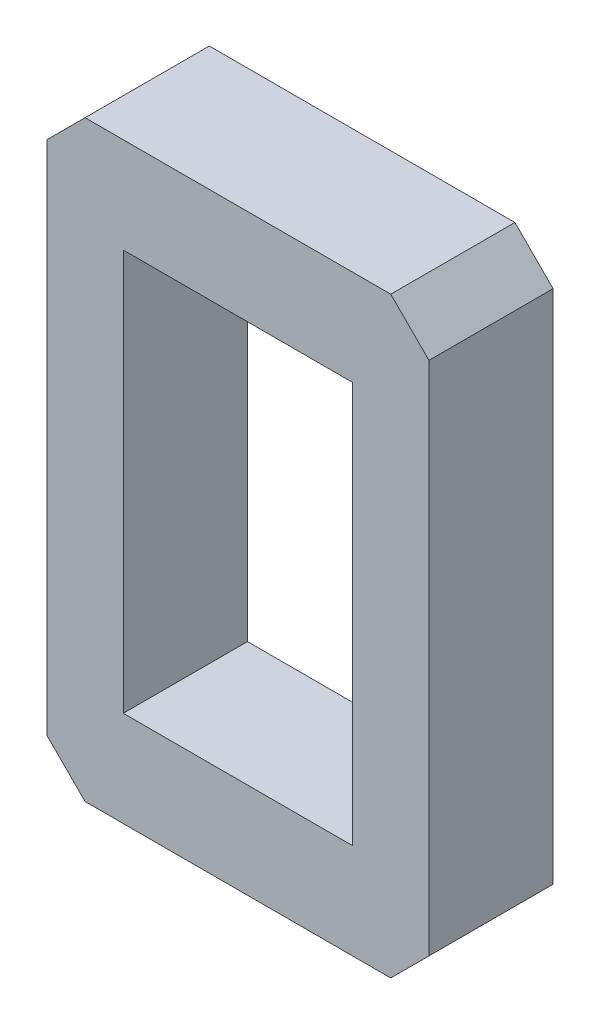
ISO-10303-21;
HEADER;
FILE_DESCRIPTION(('STEP AP214'),'2;1');
FILE_NAME('part.step','',(''),(''),'','','');
FILE_SCHEMA(('AUTOMOTIVE_DESIGN { 1 0 10303 214 1 1 1 1 }'));
ENDSEC;
DATA;
#1=APPLICATION_CONTEXT('core data for automotive mechanical design processes');
#2=APPLICATION_PROTOCOL_DEFINITION('international standard','automotive_design',2000,#1);
#3=PRODUCT_CONTEXT('',#1,'mechanical');
#4=PRODUCT('Part','Part','',(#3));
#5=PRODUCT_RELATED_PRODUCT_CATEGORY('part','',(#4));
#6=PRODUCT_DEFINITION_FORMATION('','',#4);
#7=PRODUCT_DEFINITION_CONTEXT('part definition',#1,'design');
#8=PRODUCT_DEFINITION('design','',#6,#7);
#9=PRODUCT_DEFINITION_SHAPE('','',#8);
#10=(LENGTH_UNIT() NAMED_UNIT(*) SI_UNIT(.MILLI.,.METRE.));
#11=(NAMED_UNIT(*) PLANE_ANGLE_UNIT() SI_UNIT($,.RADIAN.));
#12=(NAMED_UNIT(*) SI_UNIT($,.STERADIAN.) SOLID_ANGLE_UNIT());
#13=UNCERTAINTY_MEASURE_WITH_UNIT(LENGTH_MEASURE(1.E-05),#10,'distance_accuracy_value','');
#14=(GEOMETRIC_REPRESENTATION_CONTEXT(3) GLOBAL_UNCERTAINTY_ASSIGNED_CONTEXT((#13)) GLOBAL_UNIT_ASSIGNED_CONTEXT((#10,
#11,#12)) REPRESENTATION_CONTEXT('',''));
#15=CARTESIAN_POINT('',(0.,0.,0.));
#16=DIRECTION('',(0.,0.,1.));
#17=DIRECTION('',(1.,0.,0.));
#18=AXIS2_PLACEMENT_3D('',#15,#16,#17);
#19=CARTESIAN_POINT('',(0.,10.5,6.5));
#20=DIRECTION('',(0.,1.,0.));
#21=DIRECTION('',(0.,0.,1.));
#22=AXIS2_PLACEMENT_3D('',#19,#20,#21);
#23=PLANE('',#22);
#24=DIRECTION('',(1.,0.,0.));
#25=VECTOR('',#24,1.);
#26=CARTESIAN_POINT('',(0.,10.5,0.));
#27=LINE('',#26,#25);
#28=CARTESIAN_POINT('',(-6.,10.5,0.));
#29=VERTEX_POINT('',#28);
#30=CARTESIAN_POINT('',(6.,10.5,0.));
#31=VERTEX_POINT('',#30);
#32=EDGE_CURVE('E157',#29,#31,#27,.T.);
#33=ORIENTED_EDGE('',*,*,#32,.T.);
#34=DIRECTION('',(0.,0.,-1.));
#35=VECTOR('',#34,1.);
#36=CARTESIAN_POINT('',(6.,10.5,6.5));
#37=LINE('',#36,#35);
#38=CARTESIAN_POINT('',(6.,10.5,6.5));
#39=VERTEX_POINT('',#38);
#40=EDGE_CURVE('E139',#39,#31,#37,.T.);
#41=ORIENTED_EDGE('',*,*,#40,.F.);
#42=DIRECTION('',(1.,0.,0.));
#43=VECTOR('',#42,1.);
#44=CARTESIAN_POINT('',(0.,10.5,6.5));
#45=LINE('',#44,#43);
#46=CARTESIAN_POINT('',(-6.,10.5,6.5));
#47=VERTEX_POINT('',#46);
#48=EDGE_CURVE('E146',#47,#39,#45,.T.);
#49=ORIENTED_EDGE('',*,*,#48,.F.);
#50=DIRECTION('',(0.,0.,-1.));
#51=VECTOR('',#50,1.);
#52=CARTESIAN_POINT('',(-6.,10.5,6.5));
#53=LINE('',#52,#51);
#54=EDGE_CURVE('E229',#47,#29,#53,.T.);
#55=ORIENTED_EDGE('',*,*,#54,.T.);
#56=EDGE_LOOP('',(#33,#41,#49,#55));
#57=FACE_BOUND('',#56,.T.);
#58=ADVANCED_FACE('F43',(#57),#23,.F.);
#59=CARTESIAN_POINT('',(6.,0.,6.5));
#60=DIRECTION('',(1.,0.,0.));
#61=DIRECTION('',(0.,1.,0.));
#62=AXIS2_PLACEMENT_3D('',#59,#60,#61);
#63=PLANE('',#62);
#64=DIRECTION('',(0.,-1.,0.));
#65=VECTOR('',#64,1.);
#66=CARTESIAN_POINT('',(6.,0.,0.));
#67=LINE('',#66,#65);
#68=CARTESIAN_POINT('',(6.,-10.5,0.));
#69=VERTEX_POINT('',#68);
#70=EDGE_CURVE('E220',#31,#69,#67,.T.);
#71=ORIENTED_EDGE('',*,*,#70,.T.);
#72=DIRECTION('',(0.,0.,-1.));
#73=VECTOR('',#72,1.);
#74=CARTESIAN_POINT('',(6.,-10.5,6.5));
#75=LINE('',#74,#73);
#76=CARTESIAN_POINT('',(6.,-10.5,6.5));
#77=VERTEX_POINT('',#76);
#78=EDGE_CURVE('E141',#77,#69,#75,.T.);
#79=ORIENTED_EDGE('',*,*,#78,.F.);
#80=DIRECTION('',(0.,-1.,0.));
#81=VECTOR('',#80,1.);
#82=CARTESIAN_POINT('',(6.,0.,6.5));
#83=LINE('',#82,#81);
#84=EDGE_CURVE('E134',#39,#77,#83,.T.);
#85=ORIENTED_EDGE('',*,*,#84,.F.);
#86=ORIENTED_EDGE('',*,*,#40,.T.);
#87=EDGE_LOOP('',(#71,#79,#85,#86));
#88=FACE_BOUND('',#87,.T.);
#89=ADVANCED_FACE('F137',(#88),#63,.F.);
#90=CARTESIAN_POINT('',(0.,-10.5,6.5));
#91=DIRECTION('',(0.,1.,0.));
#92=DIRECTION('',(0.,0.,1.));
#93=AXIS2_PLACEMENT_3D('',#90,#91,#92);
#94=PLANE('',#93);
#95=DIRECTION('',(1.,0.,0.));
#96=VECTOR('',#95,1.);
#97=CARTESIAN_POINT('',(0.,-10.5,0.));
#98=LINE('',#97,#96);
#99=CARTESIAN_POINT('',(-6.,-10.5,0.));
#100=VERTEX_POINT('',#99);
#101=EDGE_CURVE('E222',#100,#69,#98,.T.);
#102=ORIENTED_EDGE('',*,*,#101,.F.);
#103=DIRECTION('',(0.,0.,-1.));
#104=VECTOR('',#103,1.);
#105=CARTESIAN_POINT('',(-6.,-10.5,6.5));
#106=LINE('',#105,#104);
#107=CARTESIAN_POINT('',(-6.,-10.5,6.5));
#108=VERTEX_POINT('',#107);
#109=EDGE_CURVE('E162',#108,#100,#106,.T.);
#110=ORIENTED_EDGE('',*,*,#109,.F.);
#111=DIRECTION('',(1.,0.,0.));
#112=VECTOR('',#111,1.);
#113=CARTESIAN_POINT('',(0.,-10.5,6.5));
#114=LINE('',#113,#112);
#115=EDGE_CURVE('E145',#108,#77,#114,.T.);
#116=ORIENTED_EDGE('',*,*,#115,.T.);
#117=ORIENTED_EDGE('',*,*,#78,.T.);
#118=EDGE_LOOP('',(#102,#110,#116,#117));
#119=FACE_BOUND('',#118,.T.);
#120=ADVANCED_FACE('F235',(#119),#94,.T.);
#121=CARTESIAN_POINT('',(10.,0.,6.5));
#122=DIRECTION('',(1.,0.,0.));
#123=DIRECTION('',(0.,1.,0.));
#124=AXIS2_PLACEMENT_3D('',#121,#122,#123);
#125=PLANE('',#124);
#126=DIRECTION('',(0.,-1.,0.));
#127=VECTOR('',#126,1.);
#128=CARTESIAN_POINT('',(10.,0.,6.5));
#129=LINE('',#128,#127);
#130=CARTESIAN_POINT('',(9.99999999999999,13.5,6.5));
#131=VERTEX_POINT('',#130);
#132=CARTESIAN_POINT('',(10.,-13.5,6.5));
#133=VERTEX_POINT('',#132);
#134=EDGE_CURVE('E228',#131,#133,#129,.T.);
#135=ORIENTED_EDGE('',*,*,#134,.T.);
#136=DIRECTION('',(0.,0.,-1.));
#137=VECTOR('',#136,1.);
#138=CARTESIAN_POINT('',(10.,-13.5,0.));
#139=LINE('',#138,#137);
#140=CARTESIAN_POINT('',(10.,-13.5,0.));
#141=VERTEX_POINT('',#140);
#142=EDGE_CURVE('E160',#133,#141,#139,.T.);
#143=ORIENTED_EDGE('',*,*,#142,.T.);
#144=DIRECTION('',(0.,-1.,0.));
#145=VECTOR('',#144,1.);
#146=CARTESIAN_POINT('',(10.,0.,0.));
#147=LINE('',#146,#145);
#148=CARTESIAN_POINT('',(9.99999999999999,13.5,0.));
#149=VERTEX_POINT('',#148);
#150=EDGE_CURVE('E210',#149,#141,#147,.T.);
#151=ORIENTED_EDGE('',*,*,#150,.F.);
#152=DIRECTION('',(0.,0.,1.));
#153=VECTOR('',#152,1.);
#154=CARTESIAN_POINT('',(9.99999999999999,13.5,6.5));
#155=LINE('',#154,#153);
#156=EDGE_CURVE('E158',#149,#131,#155,.T.);
#157=ORIENTED_EDGE('',*,*,#156,.T.);
#158=EDGE_LOOP('',(#135,#143,#151,#157));
#159=FACE_BOUND('',#158,.T.);
#160=ADVANCED_FACE('F265',(#159),#125,.T.);
#161=CARTESIAN_POINT('',(0.,15.5,6.5));
#162=DIRECTION('',(0.,1.,0.));
#163=DIRECTION('',(0.,0.,1.));
#164=AXIS2_PLACEMENT_3D('',#161,#162,#163);
#165=PLANE('',#164);
#166=DIRECTION('',(1.,0.,0.));
#167=VECTOR('',#166,1.);
#168=CARTESIAN_POINT('',(0.,15.5,0.));
#169=LINE('',#168,#167);
#170=CARTESIAN_POINT('',(-8.,15.5,0.));
#171=VERTEX_POINT('',#170);
#172=CARTESIAN_POINT('',(8.,15.5,0.));
#173=VERTEX_POINT('',#172);
#174=EDGE_CURVE('E198',#171,#173,#169,.T.);
#175=ORIENTED_EDGE('',*,*,#174,.F.);
#176=DIRECTION('',(0.,0.,1.));
#177=VECTOR('',#176,1.);
#178=CARTESIAN_POINT('',(-8.,15.5,6.5));
#179=LINE('',#178,#177);
#180=CARTESIAN_POINT('',(-8.,15.5,6.5));
#181=VERTEX_POINT('',#180);
#182=EDGE_CURVE('E11',#171,#181,#179,.T.);
#183=ORIENTED_EDGE('',*,*,#182,.T.);
#184=DIRECTION('',(1.,0.,0.));
#185=VECTOR('',#184,1.);
#186=CARTESIAN_POINT('',(0.,15.5,6.5));
#187=LINE('',#186,#185);
#188=CARTESIAN_POINT('',(8.,15.5,6.5));
#189=VERTEX_POINT('',#188);
#190=EDGE_CURVE('E200',#181,#189,#187,.T.);
#191=ORIENTED_EDGE('',*,*,#190,.T.);
#192=DIRECTION('',(0.,0.,-1.));
#193=VECTOR('',#192,1.);
#194=CARTESIAN_POINT('',(8.,15.5,6.5));
#195=LINE('',#194,#193);
#196=EDGE_CURVE('E52',#189,#173,#195,.T.);
#197=ORIENTED_EDGE('',*,*,#196,.T.);
#198=EDGE_LOOP('',(#175,#183,#191,#197));
#199=FACE_BOUND('',#198,.T.);
#200=ADVANCED_FACE('F197',(#199),#165,.T.);
#201=CARTESIAN_POINT('',(-10.,0.,6.5));
#202=DIRECTION('',(1.,0.,0.));
#203=DIRECTION('',(0.,1.,0.));
#204=AXIS2_PLACEMENT_3D('',#201,#202,#203);
#205=PLANE('',#204);
#206=DIRECTION('',(0.,-1.,0.));
#207=VECTOR('',#206,1.);
#208=CARTESIAN_POINT('',(-10.,0.,0.));
#209=LINE('',#208,#207);
#210=CARTESIAN_POINT('',(-10.,13.5,0.));
#211=VERTEX_POINT('',#210);
#212=CARTESIAN_POINT('',(-10.,-13.5,0.));
#213=VERTEX_POINT('',#212);
#214=EDGE_CURVE('E209',#211,#213,#209,.T.);
#215=ORIENTED_EDGE('',*,*,#214,.T.);
#216=DIRECTION('',(0.,0.,1.));
#217=VECTOR('',#216,1.);
#218=CARTESIAN_POINT('',(-10.,-13.5,6.5));
#219=LINE('',#218,#217);
#220=CARTESIAN_POINT('',(-10.,-13.5,6.5));
#221=VERTEX_POINT('',#220);
#222=EDGE_CURVE('E59',#213,#221,#219,.T.);
#223=ORIENTED_EDGE('',*,*,#222,.T.);
#224=DIRECTION('',(0.,-1.,0.));
#225=VECTOR('',#224,1.);
#226=CARTESIAN_POINT('',(-10.,0.,6.5));
#227=LINE('',#226,#225);
#228=CARTESIAN_POINT('',(-10.,13.5,6.5));
#229=VERTEX_POINT('',#228);
#230=EDGE_CURVE('E287',#229,#221,#227,.T.);
#231=ORIENTED_EDGE('',*,*,#230,.F.);
#232=DIRECTION('',(0.,0.,-1.));
#233=VECTOR('',#232,1.);
#234=CARTESIAN_POINT('',(-10.,13.5,0.));
#235=LINE('',#234,#233);
#236=EDGE_CURVE('E188',#229,#211,#235,.T.);
#237=ORIENTED_EDGE('',*,*,#236,.T.);
#238=EDGE_LOOP('',(#215,#223,#231,#237));
#239=FACE_BOUND('',#238,.T.);
#240=ADVANCED_FACE('F259',(#239),#205,.F.);
#241=CARTESIAN_POINT('',(0.,-15.5,6.5));
#242=DIRECTION('',(0.,1.,0.));
#243=DIRECTION('',(0.,0.,1.));
#244=AXIS2_PLACEMENT_3D('',#241,#242,#243);
#245=PLANE('',#244);
#246=DIRECTION('',(1.,0.,0.));
#247=VECTOR('',#246,1.);
#248=CARTESIAN_POINT('',(0.,-15.5,0.));
#249=LINE('',#248,#247);
#250=CARTESIAN_POINT('',(-8.00000000000001,-15.5,0.));
#251=VERTEX_POINT('',#250);
#252=CARTESIAN_POINT('',(8.,-15.5,0.));
#253=VERTEX_POINT('',#252);
#254=EDGE_CURVE('E212',#251,#253,#249,.T.);
#255=ORIENTED_EDGE('',*,*,#254,.T.);
#256=DIRECTION('',(0.,0.,1.));
#257=VECTOR('',#256,1.);
#258=CARTESIAN_POINT('',(8.,-15.5,6.5));
#259=LINE('',#258,#257);
#260=CARTESIAN_POINT('',(8.,-15.5,6.5));
#261=VERTEX_POINT('',#260);
#262=EDGE_CURVE('E179',#253,#261,#259,.T.);
#263=ORIENTED_EDGE('',*,*,#262,.T.);
#264=DIRECTION('',(1.,0.,0.));
#265=VECTOR('',#264,1.);
#266=CARTESIAN_POINT('',(0.,-15.5,6.5));
#267=LINE('',#266,#265);
#268=CARTESIAN_POINT('',(-8.00000000000001,-15.5,6.5));
#269=VERTEX_POINT('',#268);
#270=EDGE_CURVE('E154',#269,#261,#267,.T.);
#271=ORIENTED_EDGE('',*,*,#270,.F.);
#272=DIRECTION('',(0.,0.,-1.));
#273=VECTOR('',#272,1.);
#274=CARTESIAN_POINT('',(-8.00000000000001,-15.5,6.5));
#275=LINE('',#274,#273);
#276=EDGE_CURVE('E176',#269,#251,#275,.T.);
#277=ORIENTED_EDGE('',*,*,#276,.T.);
#278=EDGE_LOOP('',(#255,#263,#271,#277));
#279=FACE_BOUND('',#278,.T.);
#280=ADVANCED_FACE('F256',(#279),#245,.F.);
#281=CARTESIAN_POINT('',(-6.,0.,6.5));
#282=DIRECTION('',(1.,0.,0.));
#283=DIRECTION('',(0.,1.,0.));
#284=AXIS2_PLACEMENT_3D('',#281,#282,#283);
#285=PLANE('',#284);
#286=DIRECTION('',(0.,-1.,0.));
#287=VECTOR('',#286,1.);
#288=CARTESIAN_POINT('',(-6.,0.,0.));
#289=LINE('',#288,#287);
#290=EDGE_CURVE('E225',#29,#100,#289,.T.);
#291=ORIENTED_EDGE('',*,*,#290,.F.);
#292=ORIENTED_EDGE('',*,*,#54,.F.);
#293=DIRECTION('',(0.,-1.,0.));
#294=VECTOR('',#293,1.);
#295=CARTESIAN_POINT('',(-6.,0.,6.5));
#296=LINE('',#295,#294);
#297=EDGE_CURVE('E152',#47,#108,#296,.T.);
#298=ORIENTED_EDGE('',*,*,#297,.T.);
#299=ORIENTED_EDGE('',*,*,#109,.T.);
#300=EDGE_LOOP('',(#291,#292,#298,#299));
#301=FACE_BOUND('',#300,.T.);
#302=ADVANCED_FACE('F233',(#301),#285,.T.);
#303=CARTESIAN_POINT('',(0.,0.,6.5));
#304=DIRECTION('',(0.,0.,1.));
#305=DIRECTION('',(1.,0.,0.));
#306=AXIS2_PLACEMENT_3D('',#303,#304,#305);
#307=PLANE('',#306);
#308=ORIENTED_EDGE('',*,*,#270,.T.);
#309=DIRECTION('',(0.707106781186549,0.707106781186546,0.));
#310=VECTOR('',#309,1.);
#311=CARTESIAN_POINT('',(11.75,-11.75,6.5));
#312=LINE('',#311,#310);
#313=EDGE_CURVE('E186',#261,#133,#312,.T.);
#314=ORIENTED_EDGE('',*,*,#313,.T.);
#315=ORIENTED_EDGE('',*,*,#134,.F.);
#316=DIRECTION('',(0.707106781186546,-0.707106781186549,0.));
#317=VECTOR('',#316,1.);
#318=CARTESIAN_POINT('',(11.75,11.75,6.5));
#319=LINE('',#318,#317);
#320=EDGE_CURVE('E181',#131,#189,#319,.F.);
#321=ORIENTED_EDGE('',*,*,#320,.T.);
#322=ORIENTED_EDGE('',*,*,#190,.F.);
#323=DIRECTION('',(-0.707106781186548,-0.707106781186547,0.));
#324=VECTOR('',#323,1.);
#325=CARTESIAN_POINT('',(-11.75,11.75,6.5));
#326=LINE('',#325,#324);
#327=EDGE_CURVE('E66',#181,#229,#326,.T.);
#328=ORIENTED_EDGE('',*,*,#327,.T.);
#329=ORIENTED_EDGE('',*,*,#230,.T.);
#330=DIRECTION('',(-0.707106781186547,0.707106781186548,0.));
#331=VECTOR('',#330,1.);
#332=CARTESIAN_POINT('',(-11.75,-11.75,6.5));
#333=LINE('',#332,#331);
#334=EDGE_CURVE('E184',#221,#269,#333,.F.);
#335=ORIENTED_EDGE('',*,*,#334,.T.);
#336=EDGE_LOOP('',(#308,#314,#315,#321,#322,#328,#329,#335));
#337=FACE_BOUND('',#336,.T.);
#338=ORIENTED_EDGE('',*,*,#48,.T.);
#339=ORIENTED_EDGE('',*,*,#84,.T.);
#340=ORIENTED_EDGE('',*,*,#115,.F.);
#341=ORIENTED_EDGE('',*,*,#297,.F.);
#342=EDGE_LOOP('',(#338,#339,#340,#341));
#343=FACE_BOUND('',#342,.T.);
#344=ADVANCED_FACE('F150',(#337,#343),#307,.T.);
#345=CARTESIAN_POINT('',(0.,0.,0.));
#346=DIRECTION('',(0.,0.,1.));
#347=DIRECTION('',(1.,0.,0.));
#348=AXIS2_PLACEMENT_3D('',#345,#346,#347);
#349=PLANE('',#348);
#350=ORIENTED_EDGE('',*,*,#150,.T.);
#351=DIRECTION('',(-0.707106781186549,-0.707106781186546,0.));
#352=VECTOR('',#351,1.);
#353=CARTESIAN_POINT('',(10.,-13.5,0.));
#354=LINE('',#353,#352);
#355=EDGE_CURVE('E174',#141,#253,#354,.T.);
#356=ORIENTED_EDGE('',*,*,#355,.T.);
#357=ORIENTED_EDGE('',*,*,#254,.F.);
#358=DIRECTION('',(0.707106781186547,-0.707106781186548,0.));
#359=VECTOR('',#358,1.);
#360=CARTESIAN_POINT('',(-8.00000000000001,-15.5,0.));
#361=LINE('',#360,#359);
#362=EDGE_CURVE('E172',#251,#213,#361,.F.);
#363=ORIENTED_EDGE('',*,*,#362,.T.);
#364=ORIENTED_EDGE('',*,*,#214,.F.);
#365=DIRECTION('',(0.707106781186548,0.707106781186547,0.));
#366=VECTOR('',#365,1.);
#367=CARTESIAN_POINT('',(-10.,13.5,0.));
#368=LINE('',#367,#366);
#369=EDGE_CURVE('E170',#211,#171,#368,.T.);
#370=ORIENTED_EDGE('',*,*,#369,.T.);
#371=ORIENTED_EDGE('',*,*,#174,.T.);
#372=DIRECTION('',(-0.707106781186546,0.707106781186549,0.));
#373=VECTOR('',#372,1.);
#374=CARTESIAN_POINT('',(8.,15.5,0.));
#375=LINE('',#374,#373);
#376=EDGE_CURVE('E168',#173,#149,#375,.F.);
#377=ORIENTED_EDGE('',*,*,#376,.T.);
#378=EDGE_LOOP('',(#350,#356,#357,#363,#364,#370,#371,#377));
#379=FACE_BOUND('',#378,.T.);
#380=ORIENTED_EDGE('',*,*,#32,.F.);
#381=ORIENTED_EDGE('',*,*,#290,.T.);
#382=ORIENTED_EDGE('',*,*,#101,.T.);
#383=ORIENTED_EDGE('',*,*,#70,.F.);
#384=EDGE_LOOP('',(#380,#381,#382,#383));
#385=FACE_BOUND('',#384,.T.);
#386=ADVANCED_FACE('F205',(#379,#385),#349,.F.);
#387=CARTESIAN_POINT('',(10.,-13.5,6.5));
#388=DIRECTION('',(0.707106781186546,-0.707106781186549,0.));
#389=DIRECTION('',(0.,0.,1.));
#390=AXIS2_PLACEMENT_3D('',#387,#388,#389);
#391=PLANE('',#390);
#392=ORIENTED_EDGE('',*,*,#313,.F.);
#393=ORIENTED_EDGE('',*,*,#262,.F.);
#394=ORIENTED_EDGE('',*,*,#355,.F.);
#395=ORIENTED_EDGE('',*,*,#142,.F.);
#396=EDGE_LOOP('',(#392,#393,#394,#395));
#397=FACE_BOUND('',#396,.T.);
#398=ADVANCED_FACE('F237',(#397),#391,.T.);
#399=CARTESIAN_POINT('',(-8.00000000000001,-15.5,6.5));
#400=DIRECTION('',(0.707106781186548,0.707106781186547,0.));
#401=DIRECTION('',(0.,0.,-1.));
#402=AXIS2_PLACEMENT_3D('',#399,#400,#401);
#403=PLANE('',#402);
#404=ORIENTED_EDGE('',*,*,#334,.F.);
#405=ORIENTED_EDGE('',*,*,#222,.F.);
#406=ORIENTED_EDGE('',*,*,#362,.F.);
#407=ORIENTED_EDGE('',*,*,#276,.F.);
#408=EDGE_LOOP('',(#404,#405,#406,#407));
#409=FACE_BOUND('',#408,.T.);
#410=ADVANCED_FACE('F243',(#409),#403,.F.);
#411=CARTESIAN_POINT('',(-10.,13.5,6.5));
#412=DIRECTION('',(-0.707106781186547,0.707106781186548,0.));
#413=DIRECTION('',(0.,0.,1.));
#414=AXIS2_PLACEMENT_3D('',#411,#412,#413);
#415=PLANE('',#414);
#416=ORIENTED_EDGE('',*,*,#327,.F.);
#417=ORIENTED_EDGE('',*,*,#182,.F.);
#418=ORIENTED_EDGE('',*,*,#369,.F.);
#419=ORIENTED_EDGE('',*,*,#236,.F.);
#420=EDGE_LOOP('',(#416,#417,#418,#419));
#421=FACE_BOUND('',#420,.T.);
#422=ADVANCED_FACE('F277',(#421),#415,.T.);
#423=CARTESIAN_POINT('',(8.,15.5,6.5));
#424=DIRECTION('',(-0.707106781186549,-0.707106781186546,0.));
#425=DIRECTION('',(0.,0.,-1.));
#426=AXIS2_PLACEMENT_3D('',#423,#424,#425);
#427=PLANE('',#426);
#428=ORIENTED_EDGE('',*,*,#320,.F.);
#429=ORIENTED_EDGE('',*,*,#156,.F.);
#430=ORIENTED_EDGE('',*,*,#376,.F.);
#431=ORIENTED_EDGE('',*,*,#196,.F.);
#432=EDGE_LOOP('',(#428,#429,#430,#431));
#433=FACE_BOUND('',#432,.T.);
#434=ADVANCED_FACE('F46',(#433),#427,.F.);
#435=CLOSED_SHELL('',(#58,#89,#120,#160,#200,#240,#280,#302,#344,#386,#398,#410,#422,#434));
#436=MANIFOLD_SOLID_BREP('B2',#435);
#437=ADVANCED_BREP_SHAPE_REPRESENTATION('',(#18,#436),#14);
#438=SHAPE_DEFINITION_REPRESENTATION(#9,#437);
ENDSEC;
END-ISO-10303-21;
